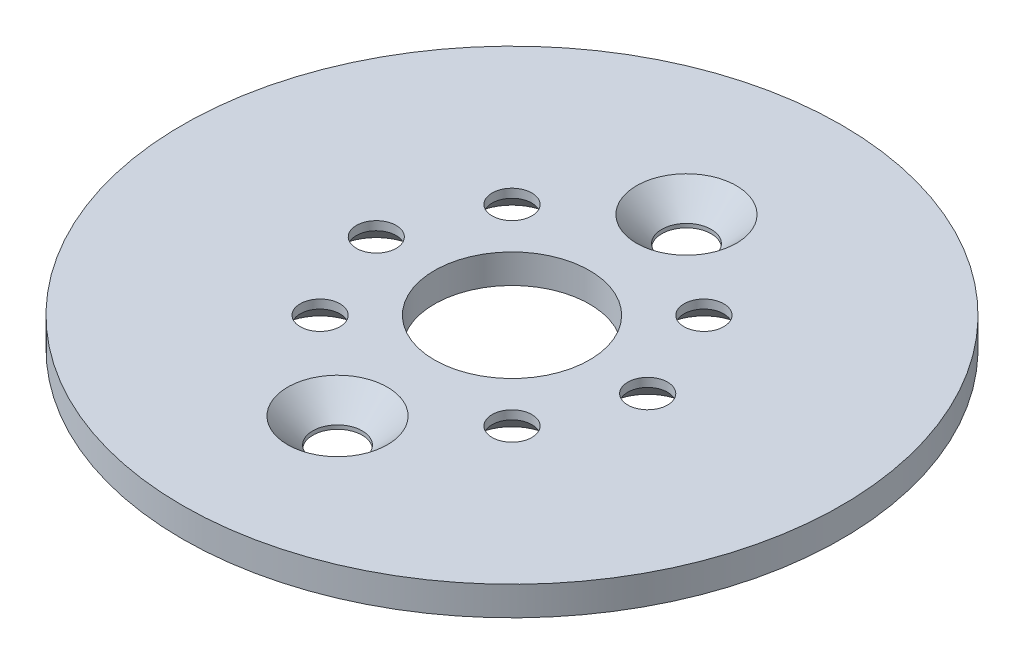
ISO-10303-21;
HEADER;
FILE_DESCRIPTION(('STEP AP214'),'2;1');
FILE_NAME('part.step','',(''),(''),'','','');
FILE_SCHEMA(('AUTOMOTIVE_DESIGN { 1 0 10303 214 1 1 1 1 }'));
ENDSEC;
DATA;
#1=APPLICATION_CONTEXT('core data for automotive mechanical design processes');
#2=APPLICATION_PROTOCOL_DEFINITION('international standard','automotive_design',2000,#1);
#3=PRODUCT_CONTEXT('',#1,'mechanical');
#4=PRODUCT('Part','Part','',(#3));
#5=PRODUCT_RELATED_PRODUCT_CATEGORY('part','',(#4));
#6=PRODUCT_DEFINITION_FORMATION('','',#4);
#7=PRODUCT_DEFINITION_CONTEXT('part definition',#1,'design');
#8=PRODUCT_DEFINITION('design','',#6,#7);
#9=PRODUCT_DEFINITION_SHAPE('','',#8);
#10=(LENGTH_UNIT() NAMED_UNIT(*) SI_UNIT(.MILLI.,.METRE.));
#11=(NAMED_UNIT(*) PLANE_ANGLE_UNIT() SI_UNIT($,.RADIAN.));
#12=(NAMED_UNIT(*) SI_UNIT($,.STERADIAN.) SOLID_ANGLE_UNIT());
#13=UNCERTAINTY_MEASURE_WITH_UNIT(LENGTH_MEASURE(1.E-05),#10,'distance_accuracy_value','');
#14=(GEOMETRIC_REPRESENTATION_CONTEXT(3) GLOBAL_UNCERTAINTY_ASSIGNED_CONTEXT((#13)) GLOBAL_UNIT_ASSIGNED_CONTEXT((#10,
#11,#12)) REPRESENTATION_CONTEXT('',''));
#15=CARTESIAN_POINT('',(0.,0.,0.));
#16=DIRECTION('',(0.,0.,1.));
#17=DIRECTION('',(1.,0.,0.));
#18=AXIS2_PLACEMENT_3D('',#15,#16,#17);
#19=CARTESIAN_POINT('',(0.,3.,0.));
#20=DIRECTION('',(0.,1.,0.));
#21=DIRECTION('',(0.,0.,1.));
#22=AXIS2_PLACEMENT_3D('',#19,#20,#21);
#23=PLANE('',#22);
#24=CARTESIAN_POINT('',(0.,3.,18.));
#25=DIRECTION('',(0.,1.,0.));
#26=DIRECTION('',(0.,0.,1.));
#27=AXIS2_PLACEMENT_3D('',#24,#25,#26);
#28=CIRCLE('',#27,5.15000000000003);
#29=CARTESIAN_POINT('',(0.,3.,23.15));
#30=VERTEX_POINT('',#29);
#31=EDGE_CURVE('E114',#30,#30,#28,.F.);
#32=ORIENTED_EDGE('',*,*,#31,.T.);
#33=EDGE_LOOP('',(#32));
#34=FACE_BOUND('',#33,.T.);
#35=CARTESIAN_POINT('',(0.,3.,-18.));
#36=DIRECTION('',(0.,1.,0.));
#37=DIRECTION('',(0.,0.,1.));
#38=AXIS2_PLACEMENT_3D('',#35,#36,#37);
#39=CIRCLE('',#38,5.15);
#40=CARTESIAN_POINT('',(0.,3.,-12.85));
#41=VERTEX_POINT('',#40);
#42=EDGE_CURVE('E119',#41,#41,#39,.F.);
#43=ORIENTED_EDGE('',*,*,#42,.T.);
#44=EDGE_LOOP('',(#43));
#45=FACE_BOUND('',#44,.T.);
#46=CARTESIAN_POINT('',(14.0000000000006,3.,-5.94284139760275E-13));
#47=DIRECTION('',(0.,1.,0.));
#48=DIRECTION('',(0.,0.,1.));
#49=AXIS2_PLACEMENT_3D('',#46,#47,#48);
#50=CIRCLE('',#49,2.05000000000044);
#51=CARTESIAN_POINT('',(14.0000000000006,3.,2.04999999999985));
#52=VERTEX_POINT('',#51);
#53=EDGE_CURVE('E210',#52,#52,#50,.T.);
#54=ORIENTED_EDGE('',*,*,#53,.F.);
#55=EDGE_LOOP('',(#54));
#56=FACE_BOUND('',#55,.T.);
#57=CARTESIAN_POINT('',(0.,3.,0.));
#58=DIRECTION('',(0.,1.,0.));
#59=DIRECTION('',(0.,0.,1.));
#60=AXIS2_PLACEMENT_3D('',#57,#58,#59);
#61=CIRCLE('',#60,8.);
#62=CARTESIAN_POINT('',(0.,3.,8.));
#63=VERTEX_POINT('',#62);
#64=EDGE_CURVE('E198',#63,#63,#61,.T.);
#65=ORIENTED_EDGE('',*,*,#64,.F.);
#66=EDGE_LOOP('',(#65));
#67=FACE_BOUND('',#66,.T.);
#68=CARTESIAN_POINT('',(-13.9999999999994,3.,5.95998645279081E-13));
#69=DIRECTION('',(0.,1.,0.));
#70=DIRECTION('',(0.,0.,1.));
#71=AXIS2_PLACEMENT_3D('',#68,#69,#70);
#72=CIRCLE('',#71,2.05000000000088);
#73=CARTESIAN_POINT('',(-13.9999999999994,3.,2.05000000000148));
#74=VERTEX_POINT('',#73);
#75=EDGE_CURVE('E190',#74,#74,#72,.T.);
#76=ORIENTED_EDGE('',*,*,#75,.F.);
#77=EDGE_LOOP('',(#76));
#78=FACE_BOUND('',#77,.T.);
#79=CARTESIAN_POINT('',(0.,3.,0.));
#80=DIRECTION('',(0.,1.,0.));
#81=DIRECTION('',(0.,0.,1.));
#82=AXIS2_PLACEMENT_3D('',#79,#80,#81);
#83=CIRCLE('',#82,34.);
#84=CARTESIAN_POINT('',(0.,3.,34.));
#85=VERTEX_POINT('',#84);
#86=EDGE_CURVE('E178',#85,#85,#83,.T.);
#87=ORIENTED_EDGE('',*,*,#86,.T.);
#88=EDGE_LOOP('',(#87));
#89=FACE_BOUND('',#88,.T.);
#90=CARTESIAN_POINT('',(-9.89949493661154,3.,-9.89949493661179));
#91=DIRECTION('',(0.,1.,0.));
#92=DIRECTION('',(0.,0.,1.));
#93=AXIS2_PLACEMENT_3D('',#90,#91,#92);
#94=CIRCLE('',#93,2.05);
#95=CARTESIAN_POINT('',(-9.89949493661154,3.,-7.84949493661179));
#96=VERTEX_POINT('',#95);
#97=EDGE_CURVE('E183',#96,#96,#94,.T.);
#98=ORIENTED_EDGE('',*,*,#97,.F.);
#99=EDGE_LOOP('',(#98));
#100=FACE_BOUND('',#99,.T.);
#101=CARTESIAN_POINT('',(-9.89949493661065,3.,9.89949493661209));
#102=DIRECTION('',(0.,1.,0.));
#103=DIRECTION('',(0.,0.,1.));
#104=AXIS2_PLACEMENT_3D('',#101,#102,#103);
#105=CIRCLE('',#104,2.05000000000121);
#106=CARTESIAN_POINT('',(-9.89949493661065,3.,11.9494949366133));
#107=VERTEX_POINT('',#106);
#108=EDGE_CURVE('E194',#107,#107,#105,.T.);
#109=ORIENTED_EDGE('',*,*,#108,.F.);
#110=EDGE_LOOP('',(#109));
#111=FACE_BOUND('',#110,.T.);
#112=CARTESIAN_POINT('',(9.89949493661168,3.,-9.89949493661165));
#113=DIRECTION('',(0.,1.,0.));
#114=DIRECTION('',(0.,0.,1.));
#115=AXIS2_PLACEMENT_3D('',#112,#113,#114);
#116=CIRCLE('',#115,2.05);
#117=CARTESIAN_POINT('',(9.89949493661168,3.,-7.84949493661165));
#118=VERTEX_POINT('',#117);
#119=EDGE_CURVE('E203',#118,#118,#116,.T.);
#120=ORIENTED_EDGE('',*,*,#119,.F.);
#121=EDGE_LOOP('',(#120));
#122=FACE_BOUND('',#121,.T.);
#123=CARTESIAN_POINT('',(9.89949493661268,3.,9.89949493661124));
#124=DIRECTION('',(0.,1.,0.));
#125=DIRECTION('',(0.,0.,1.));
#126=AXIS2_PLACEMENT_3D('',#123,#124,#125);
#127=CIRCLE('',#126,2.05000000000092);
#128=CARTESIAN_POINT('',(9.89949493661268,3.,11.9494949366122));
#129=VERTEX_POINT('',#128);
#130=EDGE_CURVE('E214',#129,#129,#127,.T.);
#131=ORIENTED_EDGE('',*,*,#130,.F.);
#132=EDGE_LOOP('',(#131));
#133=FACE_BOUND('',#132,.T.);
#134=ADVANCED_FACE('F105',(#34,#45,#56,#67,#78,#89,#100,#111,#122,#133),#23,.T.);
#135=CARTESIAN_POINT('',(0.,0.,0.));
#136=DIRECTION('',(0.,1.,0.));
#137=DIRECTION('',(0.,0.,1.));
#138=AXIS2_PLACEMENT_3D('',#135,#136,#137);
#139=PLANE('',#138);
#140=CARTESIAN_POINT('',(-9.89949493661065,0.,9.89949493661209));
#141=DIRECTION('',(0.,1.,0.));
#142=DIRECTION('',(0.,0.,1.));
#143=AXIS2_PLACEMENT_3D('',#140,#141,#142);
#144=CIRCLE('',#143,4.15000000000121);
#145=CARTESIAN_POINT('',(-9.89949493661065,0.,14.0494949366133));
#146=VERTEX_POINT('',#145);
#147=EDGE_CURVE('E154',#146,#146,#144,.T.);
#148=ORIENTED_EDGE('',*,*,#147,.T.);
#149=EDGE_LOOP('',(#148));
#150=FACE_BOUND('',#149,.T.);
#151=CARTESIAN_POINT('',(-13.9999999999994,0.,5.95998645279081E-13));
#152=DIRECTION('',(0.,1.,0.));
#153=DIRECTION('',(0.,0.,1.));
#154=AXIS2_PLACEMENT_3D('',#151,#152,#153);
#155=CIRCLE('',#154,4.1500000000009);
#156=CARTESIAN_POINT('',(-13.9999999999994,0.,4.1500000000015));
#157=VERTEX_POINT('',#156);
#158=EDGE_CURVE('E158',#157,#157,#155,.T.);
#159=ORIENTED_EDGE('',*,*,#158,.T.);
#160=EDGE_LOOP('',(#159));
#161=FACE_BOUND('',#160,.T.);
#162=CARTESIAN_POINT('',(-9.89949493661154,0.,-9.89949493661179));
#163=DIRECTION('',(0.,1.,0.));
#164=DIRECTION('',(0.,0.,1.));
#165=AXIS2_PLACEMENT_3D('',#162,#163,#164);
#166=CIRCLE('',#165,4.15);
#167=CARTESIAN_POINT('',(-9.89949493661154,0.,-5.74949493661179));
#168=VERTEX_POINT('',#167);
#169=EDGE_CURVE('E162',#168,#168,#166,.T.);
#170=ORIENTED_EDGE('',*,*,#169,.T.);
#171=EDGE_LOOP('',(#170));
#172=FACE_BOUND('',#171,.T.);
#173=CARTESIAN_POINT('',(9.89949493661168,0.,-9.89949493661165));
#174=DIRECTION('',(0.,1.,0.));
#175=DIRECTION('',(0.,0.,1.));
#176=AXIS2_PLACEMENT_3D('',#173,#174,#175);
#177=CIRCLE('',#176,4.15);
#178=CARTESIAN_POINT('',(9.89949493661168,0.,-5.74949493661165));
#179=VERTEX_POINT('',#178);
#180=EDGE_CURVE('E166',#179,#179,#177,.T.);
#181=ORIENTED_EDGE('',*,*,#180,.T.);
#182=EDGE_LOOP('',(#181));
#183=FACE_BOUND('',#182,.T.);
#184=CARTESIAN_POINT('',(14.0000000000006,0.,-5.94284139760275E-13));
#185=DIRECTION('',(0.,1.,0.));
#186=DIRECTION('',(0.,0.,1.));
#187=AXIS2_PLACEMENT_3D('',#184,#185,#186);
#188=CIRCLE('',#187,4.15000000000043);
#189=CARTESIAN_POINT('',(14.0000000000006,0.,4.14999999999984));
#190=VERTEX_POINT('',#189);
#191=EDGE_CURVE('E170',#190,#190,#188,.T.);
#192=ORIENTED_EDGE('',*,*,#191,.T.);
#193=EDGE_LOOP('',(#192));
#194=FACE_BOUND('',#193,.T.);
#195=CARTESIAN_POINT('',(9.89949493661268,0.,9.89949493661124));
#196=DIRECTION('',(0.,1.,0.));
#197=DIRECTION('',(0.,0.,1.));
#198=AXIS2_PLACEMENT_3D('',#195,#196,#197);
#199=CIRCLE('',#198,4.15000000000093);
#200=CARTESIAN_POINT('',(9.89949493661268,0.,14.0494949366122));
#201=VERTEX_POINT('',#200);
#202=EDGE_CURVE('E174',#201,#201,#199,.T.);
#203=ORIENTED_EDGE('',*,*,#202,.T.);
#204=EDGE_LOOP('',(#203));
#205=FACE_BOUND('',#204,.T.);
#206=CARTESIAN_POINT('',(0.,0.,-18.));
#207=DIRECTION('',(0.,-1.,0.));
#208=DIRECTION('',(0.,0.,-1.));
#209=AXIS2_PLACEMENT_3D('',#206,#207,#208);
#210=CIRCLE('',#209,2.55);
#211=CARTESIAN_POINT('',(0.,0.,-20.55));
#212=VERTEX_POINT('',#211);
#213=EDGE_CURVE('E218',#212,#212,#210,.T.);
#214=ORIENTED_EDGE('',*,*,#213,.F.);
#215=EDGE_LOOP('',(#214));
#216=FACE_BOUND('',#215,.T.);
#217=CARTESIAN_POINT('',(0.,0.,18.));
#218=DIRECTION('',(0.,-1.,0.));
#219=DIRECTION('',(0.,0.,-1.));
#220=AXIS2_PLACEMENT_3D('',#217,#218,#219);
#221=CIRCLE('',#220,2.55);
#222=CARTESIAN_POINT('',(0.,0.,15.45));
#223=VERTEX_POINT('',#222);
#224=EDGE_CURVE('E219',#223,#223,#221,.T.);
#225=ORIENTED_EDGE('',*,*,#224,.F.);
#226=EDGE_LOOP('',(#225));
#227=FACE_BOUND('',#226,.T.);
#228=CARTESIAN_POINT('',(0.,0.,0.));
#229=DIRECTION('',(0.,1.,0.));
#230=DIRECTION('',(0.,0.,1.));
#231=AXIS2_PLACEMENT_3D('',#228,#229,#230);
#232=CIRCLE('',#231,34.);
#233=CARTESIAN_POINT('',(0.,0.,34.));
#234=VERTEX_POINT('',#233);
#235=EDGE_CURVE('E179',#234,#234,#232,.T.);
#236=ORIENTED_EDGE('',*,*,#235,.F.);
#237=EDGE_LOOP('',(#236));
#238=FACE_BOUND('',#237,.T.);
#239=CARTESIAN_POINT('',(0.,0.,0.));
#240=DIRECTION('',(0.,1.,0.));
#241=DIRECTION('',(0.,0.,1.));
#242=AXIS2_PLACEMENT_3D('',#239,#240,#241);
#243=CIRCLE('',#242,8.);
#244=CARTESIAN_POINT('',(0.,0.,8.));
#245=VERTEX_POINT('',#244);
#246=EDGE_CURVE('E199',#245,#245,#243,.T.);
#247=ORIENTED_EDGE('',*,*,#246,.T.);
#248=EDGE_LOOP('',(#247));
#249=FACE_BOUND('',#248,.T.);
#250=ADVANCED_FACE('F229',(#150,#161,#172,#183,#194,#205,#216,#227,#238,#249),#139,.F.);
#251=CARTESIAN_POINT('',(0.,3.,0.));
#252=DIRECTION('',(0.,-1.,0.));
#253=DIRECTION('',(0.,0.,-1.));
#254=AXIS2_PLACEMENT_3D('',#251,#252,#253);
#255=CYLINDRICAL_SURFACE('',#254,34.);
#256=ORIENTED_EDGE('',*,*,#86,.F.);
#257=EDGE_LOOP('',(#256));
#258=FACE_BOUND('',#257,.T.);
#259=ORIENTED_EDGE('',*,*,#235,.T.);
#260=EDGE_LOOP('',(#259));
#261=FACE_BOUND('',#260,.T.);
#262=ADVANCED_FACE('F232',(#258,#261),#255,.T.);
#263=CARTESIAN_POINT('',(-9.89949493661154,3.,-9.89949493661179));
#264=DIRECTION('',(0.,-1.,0.));
#265=DIRECTION('',(0.,0.,-1.));
#266=AXIS2_PLACEMENT_3D('',#263,#264,#265);
#267=CYLINDRICAL_SURFACE('',#266,2.05);
#268=CARTESIAN_POINT('',(-9.89949493661154,2.10000000000002,-9.89949493661179));
#269=DIRECTION('',(0.,1.,0.));
#270=DIRECTION('',(0.,0.,1.));
#271=AXIS2_PLACEMENT_3D('',#268,#269,#270);
#272=CIRCLE('',#271,2.05);
#273=CARTESIAN_POINT('',(-9.89949493661154,2.10000000000002,-7.84949493661179));
#274=VERTEX_POINT('',#273);
#275=EDGE_CURVE('E142',#274,#274,#272,.F.);
#276=ORIENTED_EDGE('',*,*,#275,.T.);
#277=EDGE_LOOP('',(#276));
#278=FACE_BOUND('',#277,.T.);
#279=ORIENTED_EDGE('',*,*,#97,.T.);
#280=EDGE_LOOP('',(#279));
#281=FACE_BOUND('',#280,.T.);
#282=ADVANCED_FACE('F263',(#278,#281),#267,.F.);
#283=CARTESIAN_POINT('',(-13.9999999999994,3.,5.95998645279081E-13));
#284=DIRECTION('',(0.,-1.,0.));
#285=DIRECTION('',(0.,0.,-1.));
#286=AXIS2_PLACEMENT_3D('',#283,#284,#285);
#287=CYLINDRICAL_SURFACE('',#286,2.05000000000088);
#288=CARTESIAN_POINT('',(-13.9999999999994,2.10000000000003,5.95998645279081E-13));
#289=DIRECTION('',(0.,1.,0.));
#290=DIRECTION('',(0.,0.,1.));
#291=AXIS2_PLACEMENT_3D('',#288,#289,#290);
#292=CIRCLE('',#291,2.05000000000088);
#293=CARTESIAN_POINT('',(-13.9999999999994,2.10000000000003,2.05000000000148));
#294=VERTEX_POINT('',#293);
#295=EDGE_CURVE('E146',#294,#294,#292,.F.);
#296=ORIENTED_EDGE('',*,*,#295,.T.);
#297=EDGE_LOOP('',(#296));
#298=FACE_BOUND('',#297,.T.);
#299=ORIENTED_EDGE('',*,*,#75,.T.);
#300=EDGE_LOOP('',(#299));
#301=FACE_BOUND('',#300,.T.);
#302=ADVANCED_FACE('F254',(#298,#301),#287,.F.);
#303=CARTESIAN_POINT('',(-9.89949493661065,3.,9.89949493661209));
#304=DIRECTION('',(0.,-1.,0.));
#305=DIRECTION('',(0.,0.,-1.));
#306=AXIS2_PLACEMENT_3D('',#303,#304,#305);
#307=CYLINDRICAL_SURFACE('',#306,2.05000000000121);
#308=CARTESIAN_POINT('',(-9.89949493661065,2.1,9.89949493661209));
#309=DIRECTION('',(0.,1.,0.));
#310=DIRECTION('',(0.,0.,1.));
#311=AXIS2_PLACEMENT_3D('',#308,#309,#310);
#312=CIRCLE('',#311,2.05000000000121);
#313=CARTESIAN_POINT('',(-9.89949493661065,2.1,11.9494949366133));
#314=VERTEX_POINT('',#313);
#315=EDGE_CURVE('E150',#314,#314,#312,.F.);
#316=ORIENTED_EDGE('',*,*,#315,.T.);
#317=EDGE_LOOP('',(#316));
#318=FACE_BOUND('',#317,.T.);
#319=ORIENTED_EDGE('',*,*,#108,.T.);
#320=EDGE_LOOP('',(#319));
#321=FACE_BOUND('',#320,.T.);
#322=ADVANCED_FACE('F244',(#318,#321),#307,.F.);
#323=CARTESIAN_POINT('',(0.,3.,0.));
#324=DIRECTION('',(0.,-1.,0.));
#325=DIRECTION('',(0.,0.,-1.));
#326=AXIS2_PLACEMENT_3D('',#323,#324,#325);
#327=CYLINDRICAL_SURFACE('',#326,8.);
#328=ORIENTED_EDGE('',*,*,#64,.T.);
#329=EDGE_LOOP('',(#328));
#330=FACE_BOUND('',#329,.T.);
#331=ORIENTED_EDGE('',*,*,#246,.F.);
#332=EDGE_LOOP('',(#331));
#333=FACE_BOUND('',#332,.T.);
#334=ADVANCED_FACE('F241',(#330,#333),#327,.F.);
#335=CARTESIAN_POINT('',(9.89949493661168,3.,-9.89949493661165));
#336=DIRECTION('',(0.,-1.,0.));
#337=DIRECTION('',(0.,0.,-1.));
#338=AXIS2_PLACEMENT_3D('',#335,#336,#337);
#339=CYLINDRICAL_SURFACE('',#338,2.05);
#340=CARTESIAN_POINT('',(9.89949493661168,2.10000000000002,-9.89949493661165));
#341=DIRECTION('',(0.,1.,0.));
#342=DIRECTION('',(0.,0.,1.));
#343=AXIS2_PLACEMENT_3D('',#340,#341,#342);
#344=CIRCLE('',#343,2.05);
#345=CARTESIAN_POINT('',(9.89949493661168,2.10000000000002,-7.84949493661165));
#346=VERTEX_POINT('',#345);
#347=EDGE_CURVE('E138',#346,#346,#344,.F.);
#348=ORIENTED_EDGE('',*,*,#347,.T.);
#349=EDGE_LOOP('',(#348));
#350=FACE_BOUND('',#349,.T.);
#351=ORIENTED_EDGE('',*,*,#119,.T.);
#352=EDGE_LOOP('',(#351));
#353=FACE_BOUND('',#352,.T.);
#354=ADVANCED_FACE('F243',(#350,#353),#339,.F.);
#355=CARTESIAN_POINT('',(14.0000000000006,3.,-5.94284139760275E-13));
#356=DIRECTION('',(0.,-1.,0.));
#357=DIRECTION('',(0.,0.,-1.));
#358=AXIS2_PLACEMENT_3D('',#355,#356,#357);
#359=CYLINDRICAL_SURFACE('',#358,2.05000000000044);
#360=CARTESIAN_POINT('',(14.0000000000006,2.1,-5.94284139760275E-13));
#361=DIRECTION('',(0.,1.,0.));
#362=DIRECTION('',(0.,0.,1.));
#363=AXIS2_PLACEMENT_3D('',#360,#361,#362);
#364=CIRCLE('',#363,2.05000000000044);
#365=CARTESIAN_POINT('',(14.0000000000006,2.1,2.04999999999985));
#366=VERTEX_POINT('',#365);
#367=EDGE_CURVE('E134',#366,#366,#364,.F.);
#368=ORIENTED_EDGE('',*,*,#367,.T.);
#369=EDGE_LOOP('',(#368));
#370=FACE_BOUND('',#369,.T.);
#371=ORIENTED_EDGE('',*,*,#53,.T.);
#372=EDGE_LOOP('',(#371));
#373=FACE_BOUND('',#372,.T.);
#374=ADVANCED_FACE('F251',(#370,#373),#359,.F.);
#375=CARTESIAN_POINT('',(9.89949493661268,3.,9.89949493661124));
#376=DIRECTION('',(0.,-1.,0.));
#377=DIRECTION('',(0.,0.,-1.));
#378=AXIS2_PLACEMENT_3D('',#375,#376,#377);
#379=CYLINDRICAL_SURFACE('',#378,2.05000000000092);
#380=CARTESIAN_POINT('',(9.89949493661268,2.10000000000002,9.89949493661124));
#381=DIRECTION('',(0.,1.,0.));
#382=DIRECTION('',(0.,0.,1.));
#383=AXIS2_PLACEMENT_3D('',#380,#381,#382);
#384=CIRCLE('',#383,2.05000000000092);
#385=CARTESIAN_POINT('',(9.89949493661268,2.10000000000002,11.9494949366122));
#386=VERTEX_POINT('',#385);
#387=EDGE_CURVE('E130',#386,#386,#384,.F.);
#388=ORIENTED_EDGE('',*,*,#387,.T.);
#389=EDGE_LOOP('',(#388));
#390=FACE_BOUND('',#389,.T.);
#391=ORIENTED_EDGE('',*,*,#130,.T.);
#392=EDGE_LOOP('',(#391));
#393=FACE_BOUND('',#392,.T.);
#394=ADVANCED_FACE('F326',(#390,#393),#379,.F.);
#395=CARTESIAN_POINT('',(0.,10.,18.));
#396=DIRECTION('',(0.,-1.,0.));
#397=DIRECTION('',(0.,0.,-1.));
#398=AXIS2_PLACEMENT_3D('',#395,#396,#397);
#399=CYLINDRICAL_SURFACE('',#398,2.55);
#400=CARTESIAN_POINT('',(0.,0.399999999999975,18.));
#401=DIRECTION('',(0.,1.,0.));
#402=DIRECTION('',(0.,0.,1.));
#403=AXIS2_PLACEMENT_3D('',#400,#401,#402);
#404=CIRCLE('',#403,2.55);
#405=CARTESIAN_POINT('',(0.,0.399999999999975,20.55));
#406=VERTEX_POINT('',#405);
#407=EDGE_CURVE('E124',#406,#406,#404,.T.);
#408=ORIENTED_EDGE('',*,*,#407,.T.);
#409=EDGE_LOOP('',(#408));
#410=FACE_BOUND('',#409,.T.);
#411=ORIENTED_EDGE('',*,*,#224,.T.);
#412=EDGE_LOOP('',(#411));
#413=FACE_BOUND('',#412,.T.);
#414=ADVANCED_FACE('F323',(#410,#413),#399,.F.);
#415=CARTESIAN_POINT('',(0.,10.,-18.));
#416=DIRECTION('',(0.,-1.,0.));
#417=DIRECTION('',(0.,0.,-1.));
#418=AXIS2_PLACEMENT_3D('',#415,#416,#417);
#419=CYLINDRICAL_SURFACE('',#418,2.55);
#420=CARTESIAN_POINT('',(0.,0.400000000000003,-18.));
#421=DIRECTION('',(0.,1.,0.));
#422=DIRECTION('',(0.,0.,1.));
#423=AXIS2_PLACEMENT_3D('',#420,#421,#422);
#424=CIRCLE('',#423,2.55);
#425=CARTESIAN_POINT('',(0.,0.400000000000003,-15.45));
#426=VERTEX_POINT('',#425);
#427=EDGE_CURVE('E11',#426,#426,#424,.T.);
#428=ORIENTED_EDGE('',*,*,#427,.T.);
#429=EDGE_LOOP('',(#428));
#430=FACE_BOUND('',#429,.T.);
#431=ORIENTED_EDGE('',*,*,#213,.T.);
#432=EDGE_LOOP('',(#431));
#433=FACE_BOUND('',#432,.T.);
#434=ADVANCED_FACE('F227',(#430,#433),#419,.F.);
#435=CARTESIAN_POINT('',(-9.89949493661065,0.,9.89949493661209));
#436=DIRECTION('',(0.,-1.,0.));
#437=DIRECTION('',(0.,0.,-1.));
#438=AXIS2_PLACEMENT_3D('',#435,#436,#437);
#439=CONICAL_SURFACE('',#438,4.15000000000121,0.785398163397447);
#440=ORIENTED_EDGE('',*,*,#315,.F.);
#441=EDGE_LOOP('',(#440));
#442=FACE_BOUND('',#441,.T.);
#443=ORIENTED_EDGE('',*,*,#147,.F.);
#444=EDGE_LOOP('',(#443));
#445=FACE_BOUND('',#444,.T.);
#446=ADVANCED_FACE('F270',(#442,#445),#439,.F.);
#447=CARTESIAN_POINT('',(-13.9999999999994,0.,5.95998645279081E-13));
#448=DIRECTION('',(0.,-1.,0.));
#449=DIRECTION('',(0.,0.,-1.));
#450=AXIS2_PLACEMENT_3D('',#447,#448,#449);
#451=CONICAL_SURFACE('',#450,4.1500000000009,0.785398163397447);
#452=ORIENTED_EDGE('',*,*,#295,.F.);
#453=EDGE_LOOP('',(#452));
#454=FACE_BOUND('',#453,.T.);
#455=ORIENTED_EDGE('',*,*,#158,.F.);
#456=EDGE_LOOP('',(#455));
#457=FACE_BOUND('',#456,.T.);
#458=ADVANCED_FACE('F276',(#454,#457),#451,.F.);
#459=CARTESIAN_POINT('',(-9.89949493661154,0.,-9.89949493661179));
#460=DIRECTION('',(0.,-1.,0.));
#461=DIRECTION('',(0.,0.,-1.));
#462=AXIS2_PLACEMENT_3D('',#459,#460,#461);
#463=CONICAL_SURFACE('',#462,4.15,0.785398163397443);
#464=ORIENTED_EDGE('',*,*,#275,.F.);
#465=EDGE_LOOP('',(#464));
#466=FACE_BOUND('',#465,.T.);
#467=ORIENTED_EDGE('',*,*,#169,.F.);
#468=EDGE_LOOP('',(#467));
#469=FACE_BOUND('',#468,.T.);
#470=ADVANCED_FACE('F283',(#466,#469),#463,.F.);
#471=CARTESIAN_POINT('',(9.89949493661168,0.,-9.89949493661165));
#472=DIRECTION('',(0.,-1.,0.));
#473=DIRECTION('',(0.,0.,-1.));
#474=AXIS2_PLACEMENT_3D('',#471,#472,#473);
#475=CONICAL_SURFACE('',#474,4.15,0.785398163397443);
#476=ORIENTED_EDGE('',*,*,#347,.F.);
#477=EDGE_LOOP('',(#476));
#478=FACE_BOUND('',#477,.T.);
#479=ORIENTED_EDGE('',*,*,#180,.F.);
#480=EDGE_LOOP('',(#479));
#481=FACE_BOUND('',#480,.T.);
#482=ADVANCED_FACE('F290',(#478,#481),#475,.F.);
#483=CARTESIAN_POINT('',(14.0000000000006,0.,-5.94284139760275E-13));
#484=DIRECTION('',(0.,-1.,0.));
#485=DIRECTION('',(0.,0.,-1.));
#486=AXIS2_PLACEMENT_3D('',#483,#484,#485);
#487=CONICAL_SURFACE('',#486,4.15000000000043,0.785398163397447);
#488=ORIENTED_EDGE('',*,*,#367,.F.);
#489=EDGE_LOOP('',(#488));
#490=FACE_BOUND('',#489,.T.);
#491=ORIENTED_EDGE('',*,*,#191,.F.);
#492=EDGE_LOOP('',(#491));
#493=FACE_BOUND('',#492,.T.);
#494=ADVANCED_FACE('F297',(#490,#493),#487,.F.);
#495=CARTESIAN_POINT('',(9.89949493661268,0.,9.89949493661124));
#496=DIRECTION('',(0.,-1.,0.));
#497=DIRECTION('',(0.,0.,-1.));
#498=AXIS2_PLACEMENT_3D('',#495,#496,#497);
#499=CONICAL_SURFACE('',#498,4.15000000000093,0.785398163397447);
#500=ORIENTED_EDGE('',*,*,#387,.F.);
#501=EDGE_LOOP('',(#500));
#502=FACE_BOUND('',#501,.T.);
#503=ORIENTED_EDGE('',*,*,#202,.F.);
#504=EDGE_LOOP('',(#503));
#505=FACE_BOUND('',#504,.T.);
#506=ADVANCED_FACE('F304',(#502,#505),#499,.F.);
#507=CARTESIAN_POINT('',(0.,0.399999999999975,18.));
#508=DIRECTION('',(0.,1.,0.));
#509=DIRECTION('',(0.,0.,1.));
#510=AXIS2_PLACEMENT_3D('',#507,#508,#509);
#511=CONICAL_SURFACE('',#510,2.55,0.785398163397449);
#512=CARTESIAN_POINT('',(0.,3.,23.15));
#513=CARTESIAN_POINT('',(0.,2.97291666666667,23.1229166666667));
#514=CARTESIAN_POINT('',(0.,2.94583333333333,23.0958333333334));
#515=CARTESIAN_POINT('',(0.,2.89166666666667,23.0416666666667));
#516=CARTESIAN_POINT('',(0.,2.86458333333333,23.0145833333334));
#517=CARTESIAN_POINT('',(0.,2.81041666666666,22.9604166666667));
#518=CARTESIAN_POINT('',(0.,2.78333333333333,22.9333333333334));
#519=CARTESIAN_POINT('',(0.,2.72916666666666,22.8791666666667));
#520=CARTESIAN_POINT('',(0.,2.70208333333333,22.8520833333334));
#521=CARTESIAN_POINT('',(0.,2.64791666666666,22.7979166666667));
#522=CARTESIAN_POINT('',(0.,2.62083333333333,22.7708333333334));
#523=CARTESIAN_POINT('',(0.,2.56666666666666,22.7166666666667));
#524=CARTESIAN_POINT('',(0.,2.53958333333333,22.6895833333334));
#525=CARTESIAN_POINT('',(0.,2.48541666666666,22.6354166666667));
#526=CARTESIAN_POINT('',(0.,2.45833333333333,22.6083333333334));
#527=CARTESIAN_POINT('',(0.,2.40416666666666,22.5541666666667));
#528=CARTESIAN_POINT('',(0.,2.37708333333333,22.5270833333334));
#529=CARTESIAN_POINT('',(0.,2.32291666666666,22.4729166666667));
#530=CARTESIAN_POINT('',(0.,2.29583333333333,22.4458333333334));
#531=CARTESIAN_POINT('',(0.,2.24166666666666,22.3916666666667));
#532=CARTESIAN_POINT('',(0.,2.21458333333333,22.3645833333333));
#533=CARTESIAN_POINT('',(0.,2.16041666666666,22.3104166666667));
#534=CARTESIAN_POINT('',(0.,2.13333333333332,22.2833333333334));
#535=CARTESIAN_POINT('',(0.,2.07916666666666,22.2291666666667));
#536=CARTESIAN_POINT('',(0.,2.05208333333332,22.2020833333334));
#537=CARTESIAN_POINT('',(0.,1.99791666666666,22.1479166666667));
#538=CARTESIAN_POINT('',(0.,1.97083333333332,22.1208333333334));
#539=CARTESIAN_POINT('',(0.,1.91666666666666,22.0666666666667));
#540=CARTESIAN_POINT('',(0.,1.88958333333332,22.0395833333333));
#541=CARTESIAN_POINT('',(0.,1.83541666666666,21.9854166666667));
#542=CARTESIAN_POINT('',(0.,1.80833333333332,21.9583333333333));
#543=CARTESIAN_POINT('',(0.,1.75416666666665,21.9041666666667));
#544=CARTESIAN_POINT('',(0.,1.72708333333332,21.8770833333333));
#545=CARTESIAN_POINT('',(0.,1.67291666666665,21.8229166666667));
#546=CARTESIAN_POINT('',(0.,1.64583333333332,21.7958333333333));
#547=CARTESIAN_POINT('',(0.,1.59166666666665,21.7416666666667));
#548=CARTESIAN_POINT('',(0.,1.56458333333332,21.7145833333333));
#549=CARTESIAN_POINT('',(0.,1.51041666666665,21.6604166666667));
#550=CARTESIAN_POINT('',(0.,1.48333333333332,21.6333333333333));
#551=CARTESIAN_POINT('',(0.,1.42916666666665,21.5791666666667));
#552=CARTESIAN_POINT('',(0.,1.40208333333332,21.5520833333333));
#553=CARTESIAN_POINT('',(0.,1.34791666666665,21.4979166666667));
#554=CARTESIAN_POINT('',(0.,1.32083333333332,21.4708333333333));
#555=CARTESIAN_POINT('',(0.,1.26666666666665,21.4166666666667));
#556=CARTESIAN_POINT('',(0.,1.23958333333332,21.3895833333333));
#557=CARTESIAN_POINT('',(0.,1.18541666666665,21.3354166666667));
#558=CARTESIAN_POINT('',(0.,1.15833333333332,21.3083333333333));
#559=CARTESIAN_POINT('',(0.,1.10416666666665,21.2541666666667));
#560=CARTESIAN_POINT('',(0.,1.07708333333331,21.2270833333333));
#561=CARTESIAN_POINT('',(0.,1.02291666666665,21.1729166666667));
#562=CARTESIAN_POINT('',(0.,0.995833333333314,21.1458333333333));
#563=CARTESIAN_POINT('',(0.,0.941666666666647,21.0916666666667));
#564=CARTESIAN_POINT('',(0.,0.914583333333313,21.0645833333333));
#565=CARTESIAN_POINT('',(0.,0.860416666666646,21.0104166666667));
#566=CARTESIAN_POINT('',(0.,0.833333333333313,20.9833333333333));
#567=CARTESIAN_POINT('',(0.,0.779166666666645,20.9291666666667));
#568=CARTESIAN_POINT('',(0.,0.752083333333312,20.9020833333333));
#569=CARTESIAN_POINT('',(0.,0.697916666666645,20.8479166666667));
#570=CARTESIAN_POINT('',(0.,0.670833333333311,20.8208333333333));
#571=CARTESIAN_POINT('',(0.,0.616666666666644,20.7666666666667));
#572=CARTESIAN_POINT('',(0.,0.58958333333331,20.7395833333333));
#573=CARTESIAN_POINT('',(0.,0.535416666666643,20.6854166666667));
#574=CARTESIAN_POINT('',(0.,0.508333333333309,20.6583333333333));
#575=CARTESIAN_POINT('',(0.,0.454166666666642,20.6041666666667));
#576=CARTESIAN_POINT('',(0.,0.427083333333309,20.5770833333333));
#577=CARTESIAN_POINT('',(0.,0.399999999999975,20.55));
#578=B_SPLINE_CURVE_WITH_KNOTS('',3,(#512,#513,#514,#515,#516,#517,#518,#519,#520,#521,#522,
#523,#524,#525,#526,#527,#528,#529,#530,#531,#532,#533,#534,#535,#536,#537,#538,#539,#540,#541,
#542,#543,#544,#545,#546,#547,#548,#549,#550,#551,#552,#553,#554,#555,#556,#557,#558,#559,#560,
#561,#562,#563,#564,#565,#566,#567,#568,#569,#570,#571,#572,#573,#574,#575,#576,#577),
.UNSPECIFIED.,.F.,.F.,(4,2,2,2,2,2,2,2,2,2,2,2,2,2,2,2,2,2,2,2,2,2,2,2,2,2,2,2,2,2,2,2,4),(0.,
0.114904851942815,0.229809703885631,0.344714555828447,0.45961940777126,0.574524259714075,
0.689429111656891,0.804333963599707,0.919238815542522,1.03414366748534,1.14904851942815,
1.26395337137097,1.37885822331378,1.4937630752566,1.60866792719941,1.72357277914223,
1.83847763108504,1.95338248302786,2.06828733497067,2.18319218691349,2.2980970388563,
2.41300189079912,2.52790674274193,2.64281159468475,2.75771644662756,2.87262129857038,
2.98752615051319,3.10243100245601,3.21733585439883,3.33224070634164,3.44714555828445,
3.56205041022727,3.67695526217009),.UNSPECIFIED.);
#579=EDGE_CURVE('BSEAM310',#30,#406,#578,.T.);
#580=ORIENTED_EDGE('',*,*,#31,.F.);
#581=ORIENTED_EDGE('',*,*,#407,.F.);
#582=ORIENTED_EDGE('',*,*,#579,.T.);
#583=ORIENTED_EDGE('',*,*,#579,.F.);
#584=EDGE_LOOP('',(#580,#582,#581,#583));
#585=FACE_BOUND('',#584,.T.);
#586=ADVANCED_FACE('F310',(#585),#511,.F.);
#587=CARTESIAN_POINT('',(0.,0.400000000000003,-18.));
#588=DIRECTION('',(0.,1.,0.));
#589=DIRECTION('',(0.,0.,1.));
#590=AXIS2_PLACEMENT_3D('',#587,#588,#589);
#591=CONICAL_SURFACE('',#590,2.55,0.785398163397449);
#592=ORIENTED_EDGE('',*,*,#42,.F.);
#593=EDGE_LOOP('',(#592));
#594=FACE_BOUND('',#593,.T.);
#595=ORIENTED_EDGE('',*,*,#427,.F.);
#596=EDGE_LOOP('',(#595));
#597=FACE_BOUND('',#596,.T.);
#598=ADVANCED_FACE('F108',(#594,#597),#591,.F.);
#599=CLOSED_SHELL('',(#134,#250,#262,#282,#302,#322,#334,#354,#374,#394,#414,#434,#446,#458,
#470,#482,#494,#506,#586,#598));
#600=MANIFOLD_SOLID_BREP('B2',#599);
#601=ADVANCED_BREP_SHAPE_REPRESENTATION('',(#18,#600),#14);
#602=SHAPE_DEFINITION_REPRESENTATION(#9,#601);
ENDSEC;
END-ISO-10303-21;
